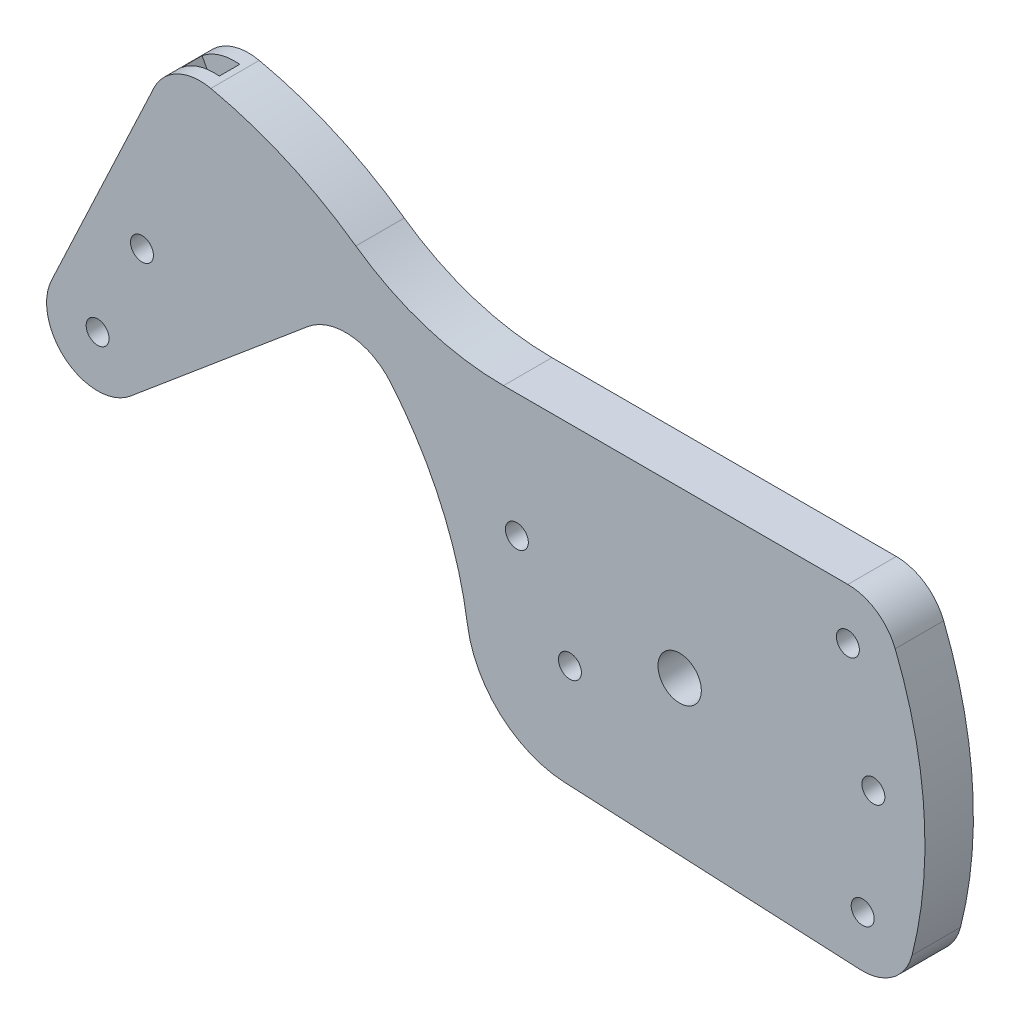
ISO-10303-21;
HEADER;
FILE_DESCRIPTION(('STEP AP214'),'2;1');
FILE_NAME('part.step','',(''),(''),'','','');
FILE_SCHEMA(('AUTOMOTIVE_DESIGN { 1 0 10303 214 1 1 1 1 }'));
ENDSEC;
DATA;
#1=APPLICATION_CONTEXT('core data for automotive mechanical design processes');
#2=APPLICATION_PROTOCOL_DEFINITION('international standard','automotive_design',2000,#1);
#3=PRODUCT_CONTEXT('',#1,'mechanical');
#4=PRODUCT('Part','Part','',(#3));
#5=PRODUCT_RELATED_PRODUCT_CATEGORY('part','',(#4));
#6=PRODUCT_DEFINITION_FORMATION('','',#4);
#7=PRODUCT_DEFINITION_CONTEXT('part definition',#1,'design');
#8=PRODUCT_DEFINITION('design','',#6,#7);
#9=PRODUCT_DEFINITION_SHAPE('','',#8);
#10=(LENGTH_UNIT() NAMED_UNIT(*) SI_UNIT(.MILLI.,.METRE.));
#11=(NAMED_UNIT(*) PLANE_ANGLE_UNIT() SI_UNIT($,.RADIAN.));
#12=(NAMED_UNIT(*) SI_UNIT($,.STERADIAN.) SOLID_ANGLE_UNIT());
#13=UNCERTAINTY_MEASURE_WITH_UNIT(LENGTH_MEASURE(1.E-05),#10,'distance_accuracy_value','');
#14=(GEOMETRIC_REPRESENTATION_CONTEXT(3) GLOBAL_UNCERTAINTY_ASSIGNED_CONTEXT((#13)) GLOBAL_UNIT_ASSIGNED_CONTEXT((#10,
#11,#12)) REPRESENTATION_CONTEXT('',''));
#15=CARTESIAN_POINT('',(0.,0.,0.));
#16=DIRECTION('',(0.,0.,1.));
#17=DIRECTION('',(1.,0.,0.));
#18=AXIS2_PLACEMENT_3D('',#15,#16,#17);
#19=CARTESIAN_POINT('',(-94.0366346201967,44.4012909844925,4.75));
#20=DIRECTION('',(0.,0.,-1.));
#21=DIRECTION('',(-1.,0.,0.));
#22=AXIS2_PLACEMENT_3D('',#19,#20,#21);
#23=CYLINDRICAL_SURFACE('',#22,9.99999999999999);
#24=CARTESIAN_POINT('',(-94.0366346201967,44.4012909844925,-4.75));
#25=DIRECTION('',(0.,0.,1.));
#26=DIRECTION('',(1.,0.,0.));
#27=AXIS2_PLACEMENT_3D('',#24,#25,#26);
#28=CIRCLE('',#27,9.99999999999999);
#29=CARTESIAN_POINT('',(-91.9187421242096,54.174444588905,-4.75));
#30=VERTEX_POINT('',#29);
#31=CARTESIAN_POINT('',(-103.085929893281,48.6569055183213,-4.75));
#32=VERTEX_POINT('',#31);
#33=EDGE_CURVE('E339',#30,#32,#28,.T.);
#34=ORIENTED_EDGE('',*,*,#33,.T.);
#35=DIRECTION('',(0.,0.,-1.));
#36=VECTOR('',#35,1.);
#37=CARTESIAN_POINT('',(-103.085929893281,48.6569055183213,4.75));
#38=LINE('',#37,#36);
#39=CARTESIAN_POINT('',(-103.085929893281,48.6569055183213,4.75));
#40=VERTEX_POINT('',#39);
#41=EDGE_CURVE('E450',#40,#32,#38,.T.);
#42=ORIENTED_EDGE('',*,*,#41,.F.);
#43=CARTESIAN_POINT('',(-94.0366346201967,44.4012909844925,4.75));
#44=DIRECTION('',(0.,0.,1.));
#45=DIRECTION('',(1.,0.,0.));
#46=AXIS2_PLACEMENT_3D('',#43,#44,#45);
#47=CIRCLE('',#46,9.99999999999999);
#48=CARTESIAN_POINT('',(-91.9187421242096,54.174444588905,4.75));
#49=VERTEX_POINT('',#48);
#50=EDGE_CURVE('E259',#49,#40,#47,.T.);
#51=ORIENTED_EDGE('',*,*,#50,.F.);
#52=DIRECTION('',(0.,0.,-1.));
#53=VECTOR('',#52,1.);
#54=CARTESIAN_POINT('',(-91.9187421242096,54.174444588905,4.75));
#55=LINE('',#54,#53);
#56=EDGE_CURVE('E50',#49,#30,#55,.T.);
#57=ORIENTED_EDGE('',*,*,#56,.T.);
#58=EDGE_LOOP('',(#34,#42,#51,#57));
#59=FACE_BOUND('',#58,.T.);
#60=CARTESIAN_POINT('',(-94.0366346201967,44.4012909844925,-2.));
#61=DIRECTION('',(0.,0.,1.));
#62=DIRECTION('',(1.,0.,0.));
#63=AXIS2_PLACEMENT_3D('',#60,#61,#62);
#64=CIRCLE('',#63,9.99999999999998);
#65=CARTESIAN_POINT('',(-93.0022176769861,54.3476461755964,-2.));
#66=VERTEX_POINT('',#65);
#67=CARTESIAN_POINT('',(-100.382341665289,52.1299391261703,-2.));
#68=VERTEX_POINT('',#67);
#69=EDGE_CURVE('E197',#66,#68,#64,.T.);
#70=ORIENTED_EDGE('',*,*,#69,.F.);
#71=DIRECTION('',(0.,0.,1.));
#72=VECTOR('',#71,1.);
#73=CARTESIAN_POINT('',(-93.0022176769861,54.3476461755964,-2.));
#74=LINE('',#73,#72);
#75=CARTESIAN_POINT('',(-93.0022176769861,54.3476461755964,2.));
#76=VERTEX_POINT('',#75);
#77=EDGE_CURVE('E179',#66,#76,#74,.T.);
#78=ORIENTED_EDGE('',*,*,#77,.T.);
#79=CARTESIAN_POINT('',(-94.0366346201967,44.4012909844925,2.));
#80=DIRECTION('',(0.,0.,1.));
#81=DIRECTION('',(1.,0.,0.));
#82=AXIS2_PLACEMENT_3D('',#79,#80,#81);
#83=CIRCLE('',#82,9.99999999999998);
#84=CARTESIAN_POINT('',(-100.382341665289,52.1299391261703,2.));
#85=VERTEX_POINT('',#84);
#86=EDGE_CURVE('E220',#76,#85,#83,.T.);
#87=ORIENTED_EDGE('',*,*,#86,.T.);
#88=DIRECTION('',(0.,0.,1.));
#89=VECTOR('',#88,1.);
#90=CARTESIAN_POINT('',(-100.382341665289,52.1299391261703,-2.));
#91=LINE('',#90,#89);
#92=EDGE_CURVE('E190',#68,#85,#91,.T.);
#93=ORIENTED_EDGE('',*,*,#92,.F.);
#94=EDGE_LOOP('',(#70,#78,#87,#93));
#95=FACE_BOUND('',#94,.T.);
#96=ADVANCED_FACE('F41',(#59,#95),#23,.T.);
#97=CARTESIAN_POINT('',(-41.5599291638824,49.5291948890183,4.75));
#98=DIRECTION('',(-0.642787609686535,0.766044443118982,0.));
#99=DIRECTION('',(-0.766044443118982,-0.642787609686535,0.));
#100=AXIS2_PLACEMENT_3D('',#97,#98,#99);
#101=PLANE('',#100);
#102=DIRECTION('',(0.766044443118982,0.642787609686535,0.));
#103=VECTOR('',#102,1.);
#104=CARTESIAN_POINT('',(-41.5599291638824,49.5291948890183,-4.75));
#105=LINE('',#104,#103);
#106=CARTESIAN_POINT('',(-107.689906175498,-5.96044443118984,-4.75));
#107=VERTEX_POINT('',#106);
#108=CARTESIAN_POINT('',(-72.8648183450266,23.2612739230748,-4.75));
#109=VERTEX_POINT('',#108);
#110=EDGE_CURVE('E350',#107,#109,#105,.T.);
#111=ORIENTED_EDGE('',*,*,#110,.T.);
#112=DIRECTION('',(0.,0.,-1.));
#113=VECTOR('',#112,1.);
#114=CARTESIAN_POINT('',(-72.8648183450266,23.2612739230748,4.75));
#115=LINE('',#114,#113);
#116=CARTESIAN_POINT('',(-72.8648183450266,23.2612739230748,4.75));
#117=VERTEX_POINT('',#116);
#118=EDGE_CURVE('E440',#117,#109,#115,.T.);
#119=ORIENTED_EDGE('',*,*,#118,.F.);
#120=DIRECTION('',(0.766044443118982,0.642787609686535,0.));
#121=VECTOR('',#120,1.);
#122=CARTESIAN_POINT('',(-41.5599291638824,49.5291948890183,4.75));
#123=LINE('',#122,#121);
#124=CARTESIAN_POINT('',(-107.689906175498,-5.96044443118984,4.75));
#125=VERTEX_POINT('',#124);
#126=EDGE_CURVE('E269',#125,#117,#123,.T.);
#127=ORIENTED_EDGE('',*,*,#126,.F.);
#128=DIRECTION('',(0.,0.,-1.));
#129=VECTOR('',#128,1.);
#130=CARTESIAN_POINT('',(-107.689906175498,-5.96044443118984,4.75));
#131=LINE('',#130,#129);
#132=EDGE_CURVE('E443',#125,#107,#131,.T.);
#133=ORIENTED_EDGE('',*,*,#132,.T.);
#134=EDGE_LOOP('',(#111,#119,#127,#133));
#135=FACE_BOUND('',#134,.T.);
#136=DIRECTION('',(0.766044443118982,0.642787609686534,0.));
#137=VECTOR('',#136,1.);
#138=CARTESIAN_POINT('',(-41.5599291638823,49.5291948890183,-2.));
#139=LINE('',#138,#137);
#140=CARTESIAN_POINT('',(-92.3690173131185,6.89530776254084,-2.));
#141=VERTEX_POINT('',#140);
#142=CARTESIAN_POINT('',(-78.2271294468595,18.7617606552691,-2.));
#143=VERTEX_POINT('',#142);
#144=EDGE_CURVE('E213',#141,#143,#139,.T.);
#145=ORIENTED_EDGE('',*,*,#144,.F.);
#146=DIRECTION('',(0.,0.,1.));
#147=VECTOR('',#146,1.);
#148=CARTESIAN_POINT('',(-92.3690173131185,6.89530776254084,-2.));
#149=LINE('',#148,#147);
#150=CARTESIAN_POINT('',(-92.3690173131185,6.89530776254084,2.));
#151=VERTEX_POINT('',#150);
#152=EDGE_CURVE('E242',#141,#151,#149,.T.);
#153=ORIENTED_EDGE('',*,*,#152,.T.);
#154=DIRECTION('',(0.766044443118982,0.642787609686534,0.));
#155=VECTOR('',#154,1.);
#156=CARTESIAN_POINT('',(-41.5599291638823,49.5291948890183,2.));
#157=LINE('',#156,#155);
#158=CARTESIAN_POINT('',(-78.2271294468595,18.7617606552691,2.));
#159=VERTEX_POINT('',#158);
#160=EDGE_CURVE('E229',#151,#159,#157,.T.);
#161=ORIENTED_EDGE('',*,*,#160,.T.);
#162=DIRECTION('',(0.,0.,1.));
#163=VECTOR('',#162,1.);
#164=CARTESIAN_POINT('',(-78.2271294468595,18.7617606552691,-2.));
#165=LINE('',#164,#163);
#166=EDGE_CURVE('E239',#143,#159,#165,.T.);
#167=ORIENTED_EDGE('',*,*,#166,.F.);
#168=EDGE_LOOP('',(#145,#153,#161,#167));
#169=FACE_BOUND('',#168,.T.);
#170=ADVANCED_FACE('F518',(#135,#169),#101,.F.);
#171=CARTESIAN_POINT('',(-34.5381520802066,82.4,4.75));
#172=DIRECTION('',(0.,0.,-1.));
#173=DIRECTION('',(-1.,0.,0.));
#174=AXIS2_PLACEMENT_3D('',#171,#172,#173);
#175=CYLINDRICAL_SURFACE('',#174,50.);
#176=CARTESIAN_POINT('',(-34.5381520802066,82.4,-4.75));
#177=DIRECTION('',(0.,0.,1.));
#178=DIRECTION('',(1.,0.,0.));
#179=AXIS2_PLACEMENT_3D('',#176,#177,#178);
#180=CIRCLE('',#179,50.);
#181=CARTESIAN_POINT('',(-63.4870210289497,41.6328197370912,-4.75));
#182=VERTEX_POINT('',#181);
#183=CARTESIAN_POINT('',(-34.5381520802066,32.4,-4.75));
#184=VERTEX_POINT('',#183);
#185=EDGE_CURVE('E238',#182,#184,#180,.T.);
#186=ORIENTED_EDGE('',*,*,#185,.F.);
#187=DIRECTION('',(0.,0.,-1.));
#188=VECTOR('',#187,1.);
#189=CARTESIAN_POINT('',(-63.4870210289497,41.6328197370912,4.75));
#190=LINE('',#189,#188);
#191=CARTESIAN_POINT('',(-63.4870210289497,41.6328197370912,4.75));
#192=VERTEX_POINT('',#191);
#193=EDGE_CURVE('E11',#192,#182,#190,.T.);
#194=ORIENTED_EDGE('',*,*,#193,.F.);
#195=CARTESIAN_POINT('',(-34.5381520802066,82.4,4.75));
#196=DIRECTION('',(0.,0.,1.));
#197=DIRECTION('',(1.,0.,0.));
#198=AXIS2_PLACEMENT_3D('',#195,#196,#197);
#199=CIRCLE('',#198,50.);
#200=CARTESIAN_POINT('',(-34.5381520802066,32.4,4.75));
#201=VERTEX_POINT('',#200);
#202=EDGE_CURVE('E251',#192,#201,#199,.T.);
#203=ORIENTED_EDGE('',*,*,#202,.T.);
#204=DIRECTION('',(0.,0.,-1.));
#205=VECTOR('',#204,1.);
#206=CARTESIAN_POINT('',(-34.5381520802066,32.4,4.75));
#207=LINE('',#206,#205);
#208=EDGE_CURVE('E332',#201,#184,#207,.T.);
#209=ORIENTED_EDGE('',*,*,#208,.T.);
#210=EDGE_LOOP('',(#186,#194,#203,#209));
#211=FACE_BOUND('',#210,.T.);
#212=ADVANCED_FACE('F43',(#211),#175,.F.);
#213=CARTESIAN_POINT('',(-108.317782272363,-21.5,4.75));
#214=DIRECTION('',(0.,0.,-1.));
#215=DIRECTION('',(-1.,0.,0.));
#216=AXIS2_PLACEMENT_3D('',#213,#214,#215);
#217=CYLINDRICAL_SURFACE('',#216,77.4309374967139);
#218=CARTESIAN_POINT('',(-108.317782272363,-21.5,-4.75));
#219=DIRECTION('',(0.,0.,1.));
#220=DIRECTION('',(1.,0.,0.));
#221=AXIS2_PLACEMENT_3D('',#218,#219,#220);
#222=CIRCLE('',#221,77.4309374967139);
#223=EDGE_CURVE('E336',#182,#30,#222,.T.);
#224=ORIENTED_EDGE('',*,*,#223,.T.);
#225=ORIENTED_EDGE('',*,*,#56,.F.);
#226=CARTESIAN_POINT('',(-108.317782272363,-21.5,4.75));
#227=DIRECTION('',(0.,0.,1.));
#228=DIRECTION('',(1.,0.,0.));
#229=AXIS2_PLACEMENT_3D('',#226,#227,#228);
#230=CIRCLE('',#229,77.4309374967139);
#231=EDGE_CURVE('E255',#192,#49,#230,.T.);
#232=ORIENTED_EDGE('',*,*,#231,.F.);
#233=ORIENTED_EDGE('',*,*,#193,.T.);
#234=EDGE_LOOP('',(#224,#225,#232,#233));
#235=FACE_BOUND('',#234,.T.);
#236=ADVANCED_FACE('F480',(#235),#217,.T.);
#237=CARTESIAN_POINT('',(-103.154731418742,48.5106034239492,4.75));
#238=DIRECTION('',(-0.904929527308425,0.425561453382882,0.));
#239=DIRECTION('',(-0.425561453382882,-0.904929527308425,0.));
#240=AXIS2_PLACEMENT_3D('',#237,#238,#239);
#241=PLANE('',#240);
#242=DIRECTION('',(0.425561453382882,0.904929527308425,0.));
#243=VECTOR('',#242,1.);
#244=CARTESIAN_POINT('',(-103.154731418742,48.5106034239492,-4.75));
#245=LINE('',#244,#243);
#246=CARTESIAN_POINT('',(-123.167077545448,5.9556145338288,-4.75));
#247=VERTEX_POINT('',#246);
#248=EDGE_CURVE('E343',#247,#32,#245,.T.);
#249=ORIENTED_EDGE('',*,*,#248,.F.);
#250=DIRECTION('',(0.,0.,-1.));
#251=VECTOR('',#250,1.);
#252=CARTESIAN_POINT('',(-123.167077545448,5.9556145338288,4.75));
#253=LINE('',#252,#251);
#254=CARTESIAN_POINT('',(-123.167077545448,5.9556145338288,4.75));
#255=VERTEX_POINT('',#254);
#256=EDGE_CURVE('E447',#255,#247,#253,.T.);
#257=ORIENTED_EDGE('',*,*,#256,.F.);
#258=DIRECTION('',(0.425561453382882,0.904929527308425,0.));
#259=VECTOR('',#258,1.);
#260=CARTESIAN_POINT('',(-103.154731418742,48.5106034239492,4.75));
#261=LINE('',#260,#259);
#262=EDGE_CURVE('E262',#255,#40,#261,.T.);
#263=ORIENTED_EDGE('',*,*,#262,.T.);
#264=ORIENTED_EDGE('',*,*,#41,.T.);
#265=EDGE_LOOP('',(#249,#257,#263,#264));
#266=FACE_BOUND('',#265,.T.);
#267=ADVANCED_FACE('F471',(#266),#241,.T.);
#268=CARTESIAN_POINT('',(-114.117782272363,1.69999999999999,4.75));
#269=DIRECTION('',(0.,0.,-1.));
#270=DIRECTION('',(-1.,0.,0.));
#271=AXIS2_PLACEMENT_3D('',#268,#269,#270);
#272=CYLINDRICAL_SURFACE('',#271,9.99999999999999);
#273=CARTESIAN_POINT('',(-114.117782272363,1.69999999999999,-4.75));
#274=DIRECTION('',(0.,0.,1.));
#275=DIRECTION('',(1.,0.,0.));
#276=AXIS2_PLACEMENT_3D('',#273,#274,#275);
#277=CIRCLE('',#276,9.99999999999999);
#278=EDGE_CURVE('E347',#247,#107,#277,.T.);
#279=ORIENTED_EDGE('',*,*,#278,.T.);
#280=ORIENTED_EDGE('',*,*,#132,.F.);
#281=CARTESIAN_POINT('',(-114.117782272363,1.69999999999999,4.75));
#282=DIRECTION('',(0.,0.,1.));
#283=DIRECTION('',(1.,0.,0.));
#284=AXIS2_PLACEMENT_3D('',#281,#282,#283);
#285=CIRCLE('',#284,9.99999999999999);
#286=EDGE_CURVE('E266',#255,#125,#285,.T.);
#287=ORIENTED_EDGE('',*,*,#286,.F.);
#288=ORIENTED_EDGE('',*,*,#256,.T.);
#289=EDGE_LOOP('',(#279,#280,#287,#288));
#290=FACE_BOUND('',#289,.T.);
#291=ADVANCED_FACE('F522',(#290),#272,.T.);
#292=CARTESIAN_POINT('',(-65.4725042221845,14.4514570095927,4.75));
#293=DIRECTION('',(0.,0.,-1.));
#294=DIRECTION('',(-1.,0.,0.));
#295=AXIS2_PLACEMENT_3D('',#292,#293,#294);
#296=CYLINDRICAL_SURFACE('',#295,11.5003992165423);
#297=CARTESIAN_POINT('',(-65.4725042221845,14.4514570095927,-4.75));
#298=DIRECTION('',(0.,0.,1.));
#299=DIRECTION('',(1.,0.,0.));
#300=AXIS2_PLACEMENT_3D('',#297,#298,#299);
#301=CIRCLE('',#300,11.5003992165423);
#302=CARTESIAN_POINT('',(-56.6626873087024,21.8437711324349,-4.75));
#303=VERTEX_POINT('',#302);
#304=EDGE_CURVE('E354',#303,#109,#301,.T.);
#305=ORIENTED_EDGE('',*,*,#304,.F.);
#306=DIRECTION('',(0.,0.,-1.));
#307=VECTOR('',#306,1.);
#308=CARTESIAN_POINT('',(-56.6626873087024,21.8437711324349,4.75));
#309=LINE('',#308,#307);
#310=CARTESIAN_POINT('',(-56.6626873087024,21.8437711324349,4.75));
#311=VERTEX_POINT('',#310);
#312=EDGE_CURVE('E437',#311,#303,#309,.T.);
#313=ORIENTED_EDGE('',*,*,#312,.F.);
#314=CARTESIAN_POINT('',(-65.4725042221845,14.4514570095927,4.75));
#315=DIRECTION('',(0.,0.,1.));
#316=DIRECTION('',(1.,0.,0.));
#317=AXIS2_PLACEMENT_3D('',#314,#315,#316);
#318=CIRCLE('',#317,11.5003992165423);
#319=EDGE_CURVE('E272',#311,#117,#318,.T.);
#320=ORIENTED_EDGE('',*,*,#319,.T.);
#321=ORIENTED_EDGE('',*,*,#118,.T.);
#322=EDGE_LOOP('',(#305,#313,#320,#321));
#323=FACE_BOUND('',#322,.T.);
#324=ADVANCED_FACE('F515',(#323),#296,.F.);
#325=CARTESIAN_POINT('',(-108.317782272363,-21.5,4.75));
#326=DIRECTION('',(0.,0.,-1.));
#327=DIRECTION('',(-1.,0.,0.));
#328=AXIS2_PLACEMENT_3D('',#325,#326,#327);
#329=CYLINDRICAL_SURFACE('',#328,67.4309374967139);
#330=CARTESIAN_POINT('',(-108.317782272363,-21.5,-4.75));
#331=DIRECTION('',(0.,0.,1.));
#332=DIRECTION('',(1.,0.,0.));
#333=AXIS2_PLACEMENT_3D('',#330,#331,#332);
#334=CIRCLE('',#333,67.4309374967139);
#335=CARTESIAN_POINT('',(-41.6082780723541,-11.662653758524,-4.75));
#336=VERTEX_POINT('',#335);
#337=EDGE_CURVE('E358',#336,#303,#334,.T.);
#338=ORIENTED_EDGE('',*,*,#337,.F.);
#339=DIRECTION('',(0.,0.,-1.));
#340=VECTOR('',#339,1.);
#341=CARTESIAN_POINT('',(-41.6082780723541,-11.662653758524,4.75));
#342=LINE('',#341,#340);
#343=CARTESIAN_POINT('',(-41.6082780723541,-11.662653758524,4.75));
#344=VERTEX_POINT('',#343);
#345=EDGE_CURVE('E434',#344,#336,#342,.T.);
#346=ORIENTED_EDGE('',*,*,#345,.F.);
#347=CARTESIAN_POINT('',(-108.317782272363,-21.5,4.75));
#348=DIRECTION('',(0.,0.,1.));
#349=DIRECTION('',(1.,0.,0.));
#350=AXIS2_PLACEMENT_3D('',#347,#348,#349);
#351=CIRCLE('',#350,67.4309374967139);
#352=EDGE_CURVE('E276',#344,#311,#351,.T.);
#353=ORIENTED_EDGE('',*,*,#352,.T.);
#354=ORIENTED_EDGE('',*,*,#312,.T.);
#355=EDGE_LOOP('',(#338,#346,#353,#354));
#356=FACE_BOUND('',#355,.T.);
#357=ADVANCED_FACE('F509',(#356),#329,.F.);
#358=CARTESIAN_POINT('',(-21.5177822723635,-8.70000000000001,4.75));
#359=DIRECTION('',(0.,0.,-1.));
#360=DIRECTION('',(-1.,0.,0.));
#361=AXIS2_PLACEMENT_3D('',#358,#359,#360);
#362=CYLINDRICAL_SURFACE('',#361,20.3077654797946);
#363=CARTESIAN_POINT('',(-21.5177822723635,-8.70000000000001,-4.75));
#364=DIRECTION('',(0.,0.,1.));
#365=DIRECTION('',(1.,0.,0.));
#366=AXIS2_PLACEMENT_3D('',#363,#364,#365);
#367=CIRCLE('',#366,20.3077654797946);
#368=CARTESIAN_POINT('',(-22.5002308320871,-28.9839871230938,-4.75));
#369=VERTEX_POINT('',#368);
#370=EDGE_CURVE('E362',#336,#369,#367,.T.);
#371=ORIENTED_EDGE('',*,*,#370,.T.);
#372=DIRECTION('',(0.,0.,-1.));
#373=VECTOR('',#372,1.);
#374=CARTESIAN_POINT('',(-22.5002308320871,-28.9839871230938,4.75));
#375=LINE('',#374,#373);
#376=CARTESIAN_POINT('',(-22.5002308320871,-28.9839871230938,4.75));
#377=VERTEX_POINT('',#376);
#378=EDGE_CURVE('E431',#377,#369,#375,.T.);
#379=ORIENTED_EDGE('',*,*,#378,.F.);
#380=CARTESIAN_POINT('',(-21.5177822723635,-8.70000000000001,4.75));
#381=DIRECTION('',(0.,0.,1.));
#382=DIRECTION('',(1.,0.,0.));
#383=AXIS2_PLACEMENT_3D('',#380,#381,#382);
#384=CIRCLE('',#383,20.3077654797946);
#385=EDGE_CURVE('E280',#344,#377,#384,.T.);
#386=ORIENTED_EDGE('',*,*,#385,.F.);
#387=ORIENTED_EDGE('',*,*,#345,.T.);
#388=EDGE_LOOP('',(#371,#379,#386,#387));
#389=FACE_BOUND('',#388,.T.);
#390=ADVANCED_FACE('F712',(#389),#362,.T.);
#391=CARTESIAN_POINT('',(-1.45320494845944,-30.0033932260633,4.75));
#392=DIRECTION('',(-0.0483779744601208,-0.998829100290503,0.));
#393=DIRECTION('',(0.998829100290503,-0.0483779744601208,0.));
#394=AXIS2_PLACEMENT_3D('',#391,#392,#393);
#395=PLANE('',#394);
#396=DIRECTION('',(-0.998829100290503,0.0483779744601208,0.));
#397=VECTOR('',#396,1.);
#398=CARTESIAN_POINT('',(-1.45320494845944,-30.0033932260633,-4.75));
#399=LINE('',#398,#397);
#400=CARTESIAN_POINT('',(35.3984379830354,-31.788291002905,-4.75));
#401=VERTEX_POINT('',#400);
#402=EDGE_CURVE('E366',#401,#369,#399,.T.);
#403=ORIENTED_EDGE('',*,*,#402,.F.);
#404=DIRECTION('',(0.,0.,-1.));
#405=VECTOR('',#404,1.);
#406=CARTESIAN_POINT('',(35.3984379830354,-31.788291002905,4.75));
#407=LINE('',#406,#405);
#408=CARTESIAN_POINT('',(35.3984379830354,-31.788291002905,4.75));
#409=VERTEX_POINT('',#408);
#410=EDGE_CURVE('E428',#409,#401,#407,.T.);
#411=ORIENTED_EDGE('',*,*,#410,.F.);
#412=DIRECTION('',(-0.998829100290503,0.0483779744601208,0.));
#413=VECTOR('',#412,1.);
#414=CARTESIAN_POINT('',(-1.45320494845944,-30.0033932260633,4.75));
#415=LINE('',#414,#413);
#416=EDGE_CURVE('E283',#409,#377,#415,.T.);
#417=ORIENTED_EDGE('',*,*,#416,.T.);
#418=ORIENTED_EDGE('',*,*,#378,.T.);
#419=EDGE_LOOP('',(#403,#411,#417,#418));
#420=FACE_BOUND('',#419,.T.);
#421=ADVANCED_FACE('F503',(#420),#395,.T.);
#422=CARTESIAN_POINT('',(35.8822177276366,-21.8,4.75));
#423=DIRECTION('',(0.,0.,-1.));
#424=DIRECTION('',(-1.,0.,0.));
#425=AXIS2_PLACEMENT_3D('',#422,#423,#424);
#426=CYLINDRICAL_SURFACE('',#425,9.99999999999999);
#427=CARTESIAN_POINT('',(35.8822177276366,-21.8,-4.75));
#428=DIRECTION('',(0.,0.,1.));
#429=DIRECTION('',(1.,0.,0.));
#430=AXIS2_PLACEMENT_3D('',#427,#428,#429);
#431=CIRCLE('',#430,9.99999999999999);
#432=CARTESIAN_POINT('',(45.5722671365024,-24.2704134175759,-4.75));
#433=VERTEX_POINT('',#432);
#434=EDGE_CURVE('E370',#401,#433,#431,.T.);
#435=ORIENTED_EDGE('',*,*,#434,.T.);
#436=DIRECTION('',(0.,0.,-1.));
#437=VECTOR('',#436,1.);
#438=CARTESIAN_POINT('',(45.5722671365024,-24.2704134175759,4.75));
#439=LINE('',#438,#437);
#440=CARTESIAN_POINT('',(45.5722671365024,-24.2704134175759,4.75));
#441=VERTEX_POINT('',#440);
#442=EDGE_CURVE('E424',#441,#433,#439,.T.);
#443=ORIENTED_EDGE('',*,*,#442,.F.);
#444=CARTESIAN_POINT('',(35.8822177276366,-21.8,4.75));
#445=DIRECTION('',(0.,0.,1.));
#446=DIRECTION('',(1.,0.,0.));
#447=AXIS2_PLACEMENT_3D('',#444,#445,#446);
#448=CIRCLE('',#447,9.99999999999999);
#449=EDGE_CURVE('E287',#409,#441,#448,.T.);
#450=ORIENTED_EDGE('',*,*,#449,.F.);
#451=ORIENTED_EDGE('',*,*,#410,.T.);
#452=EDGE_LOOP('',(#435,#443,#450,#451));
#453=FACE_BOUND('',#452,.T.);
#454=ADVANCED_FACE('F500',(#453),#426,.T.);
#455=CARTESIAN_POINT('',(-33.3576699128129,-4.14775280898879,4.75));
#456=DIRECTION('',(0.,0.,-1.));
#457=DIRECTION('',(-1.,0.,0.));
#458=AXIS2_PLACEMENT_3D('',#455,#456,#457);
#459=CYLINDRICAL_SURFACE('',#458,81.4546280611314);
#460=CARTESIAN_POINT('',(-33.3576699128129,-4.14775280898879,-4.75));
#461=DIRECTION('',(0.,0.,1.));
#462=DIRECTION('',(1.,0.,0.));
#463=AXIS2_PLACEMENT_3D('',#460,#461,#462);
#464=CIRCLE('',#463,81.4546280611314);
#465=CARTESIAN_POINT('',(42.2664151883936,26.1153300673927,-4.75));
#466=VERTEX_POINT('',#465);
#467=EDGE_CURVE('E373',#433,#466,#464,.T.);
#468=ORIENTED_EDGE('',*,*,#467,.T.);
#469=DIRECTION('',(0.,0.,-1.));
#470=VECTOR('',#469,1.);
#471=CARTESIAN_POINT('',(42.2664151883936,26.1153300673927,4.75));
#472=LINE('',#471,#470);
#473=CARTESIAN_POINT('',(42.2664151883936,26.1153300673927,4.75));
#474=VERTEX_POINT('',#473);
#475=EDGE_CURVE('E420',#474,#466,#472,.T.);
#476=ORIENTED_EDGE('',*,*,#475,.F.);
#477=CARTESIAN_POINT('',(-33.3576699128129,-4.14775280898879,4.75));
#478=DIRECTION('',(0.,0.,1.));
#479=DIRECTION('',(1.,0.,0.));
#480=AXIS2_PLACEMENT_3D('',#477,#478,#479);
#481=CIRCLE('',#480,81.4546280611314);
#482=EDGE_CURVE('E290',#441,#474,#481,.T.);
#483=ORIENTED_EDGE('',*,*,#482,.F.);
#484=ORIENTED_EDGE('',*,*,#442,.T.);
#485=EDGE_LOOP('',(#468,#476,#483,#484));
#486=FACE_BOUND('',#485,.T.);
#487=ADVANCED_FACE('F495',(#486),#459,.T.);
#488=CARTESIAN_POINT('',(32.9822177276365,22.4,4.75));
#489=DIRECTION('',(0.,0.,-1.));
#490=DIRECTION('',(-1.,0.,0.));
#491=AXIS2_PLACEMENT_3D('',#488,#489,#490);
#492=CYLINDRICAL_SURFACE('',#491,9.99999999999999);
#493=CARTESIAN_POINT('',(32.9822177276365,22.4,-4.75));
#494=DIRECTION('',(0.,0.,1.));
#495=DIRECTION('',(1.,0.,0.));
#496=AXIS2_PLACEMENT_3D('',#493,#494,#495);
#497=CIRCLE('',#496,9.99999999999999);
#498=CARTESIAN_POINT('',(32.9822177276365,32.4,-4.75));
#499=VERTEX_POINT('',#498);
#500=EDGE_CURVE('E376',#466,#499,#497,.T.);
#501=ORIENTED_EDGE('',*,*,#500,.T.);
#502=DIRECTION('',(0.,0.,-1.));
#503=VECTOR('',#502,1.);
#504=CARTESIAN_POINT('',(32.9822177276365,32.4,4.75));
#505=LINE('',#504,#503);
#506=CARTESIAN_POINT('',(32.9822177276365,32.4,4.75));
#507=VERTEX_POINT('',#506);
#508=EDGE_CURVE('E417',#507,#499,#505,.T.);
#509=ORIENTED_EDGE('',*,*,#508,.F.);
#510=CARTESIAN_POINT('',(32.9822177276365,22.4,4.75));
#511=DIRECTION('',(0.,0.,1.));
#512=DIRECTION('',(1.,0.,0.));
#513=AXIS2_PLACEMENT_3D('',#510,#511,#512);
#514=CIRCLE('',#513,9.99999999999999);
#515=EDGE_CURVE('E293',#474,#507,#514,.T.);
#516=ORIENTED_EDGE('',*,*,#515,.F.);
#517=ORIENTED_EDGE('',*,*,#475,.T.);
#518=EDGE_LOOP('',(#501,#509,#516,#517));
#519=FACE_BOUND('',#518,.T.);
#520=ADVANCED_FACE('F489',(#519),#492,.T.);
#521=CARTESIAN_POINT('',(-105.417782272363,20.2,4.75));
#522=DIRECTION('',(0.,0.,-1.));
#523=DIRECTION('',(-1.,0.,0.));
#524=AXIS2_PLACEMENT_3D('',#521,#522,#523);
#525=CYLINDRICAL_SURFACE('',#524,2.25);
#526=CARTESIAN_POINT('',(-105.417782272363,20.2,4.75));
#527=DIRECTION('',(0.,0.,1.));
#528=DIRECTION('',(1.,0.,0.));
#529=AXIS2_PLACEMENT_3D('',#526,#527,#528);
#530=CIRCLE('',#529,2.25);
#531=CARTESIAN_POINT('',(-103.167782272363,20.2,4.75));
#532=VERTEX_POINT('',#531);
#533=EDGE_CURVE('E324',#532,#532,#530,.T.);
#534=ORIENTED_EDGE('',*,*,#533,.T.);
#535=EDGE_LOOP('',(#534));
#536=FACE_BOUND('',#535,.T.);
#537=CARTESIAN_POINT('',(-105.417782272363,20.2,-4.75));
#538=DIRECTION('',(0.,0.,1.));
#539=DIRECTION('',(1.,0.,0.));
#540=AXIS2_PLACEMENT_3D('',#537,#538,#539);
#541=CIRCLE('',#540,2.25);
#542=CARTESIAN_POINT('',(-103.167782272363,20.2,-4.75));
#543=VERTEX_POINT('',#542);
#544=EDGE_CURVE('E408',#543,#543,#541,.T.);
#545=ORIENTED_EDGE('',*,*,#544,.F.);
#546=EDGE_LOOP('',(#545));
#547=FACE_BOUND('',#546,.T.);
#548=ADVANCED_FACE('F664',(#536,#547),#525,.F.);
#549=CARTESIAN_POINT('',(0.,0.,4.75));
#550=DIRECTION('',(0.,0.,-1.));
#551=DIRECTION('',(-1.,0.,0.));
#552=AXIS2_PLACEMENT_3D('',#549,#550,#551);
#553=CYLINDRICAL_SURFACE('',#552,4.25);
#554=CARTESIAN_POINT('',(0.,0.,4.75));
#555=DIRECTION('',(0.,0.,1.));
#556=DIRECTION('',(1.,0.,0.));
#557=AXIS2_PLACEMENT_3D('',#554,#555,#556);
#558=CIRCLE('',#557,4.25);
#559=CARTESIAN_POINT('',(4.25,0.,4.75));
#560=VERTEX_POINT('',#559);
#561=EDGE_CURVE('E320',#560,#560,#558,.T.);
#562=ORIENTED_EDGE('',*,*,#561,.T.);
#563=EDGE_LOOP('',(#562));
#564=FACE_BOUND('',#563,.T.);
#565=CARTESIAN_POINT('',(0.,0.,-4.75));
#566=DIRECTION('',(0.,0.,1.));
#567=DIRECTION('',(1.,0.,0.));
#568=AXIS2_PLACEMENT_3D('',#565,#566,#567);
#569=CIRCLE('',#568,4.25);
#570=CARTESIAN_POINT('',(4.25,0.,-4.75));
#571=VERTEX_POINT('',#570);
#572=EDGE_CURVE('E404',#571,#571,#569,.T.);
#573=ORIENTED_EDGE('',*,*,#572,.F.);
#574=EDGE_LOOP('',(#573));
#575=FACE_BOUND('',#574,.T.);
#576=ADVANCED_FACE('F653',(#564,#575),#553,.F.);
#577=CARTESIAN_POINT('',(-31.9177822723635,8.19999999999999,4.75));
#578=DIRECTION('',(0.,0.,-1.));
#579=DIRECTION('',(-1.,0.,0.));
#580=AXIS2_PLACEMENT_3D('',#577,#578,#579);
#581=CYLINDRICAL_SURFACE('',#580,2.25);
#582=CARTESIAN_POINT('',(-31.9177822723635,8.19999999999999,4.75));
#583=DIRECTION('',(0.,0.,1.));
#584=DIRECTION('',(1.,0.,0.));
#585=AXIS2_PLACEMENT_3D('',#582,#583,#584);
#586=CIRCLE('',#585,2.25);
#587=CARTESIAN_POINT('',(-29.6677822723635,8.19999999999999,4.75));
#588=VERTEX_POINT('',#587);
#589=EDGE_CURVE('E316',#588,#588,#586,.T.);
#590=ORIENTED_EDGE('',*,*,#589,.T.);
#591=EDGE_LOOP('',(#590));
#592=FACE_BOUND('',#591,.T.);
#593=CARTESIAN_POINT('',(-31.9177822723635,8.19999999999999,-4.75));
#594=DIRECTION('',(0.,0.,1.));
#595=DIRECTION('',(1.,0.,0.));
#596=AXIS2_PLACEMENT_3D('',#593,#594,#595);
#597=CIRCLE('',#596,2.25);
#598=CARTESIAN_POINT('',(-29.6677822723635,8.19999999999999,-4.75));
#599=VERTEX_POINT('',#598);
#600=EDGE_CURVE('E400',#599,#599,#597,.T.);
#601=ORIENTED_EDGE('',*,*,#600,.F.);
#602=EDGE_LOOP('',(#601));
#603=FACE_BOUND('',#602,.T.);
#604=ADVANCED_FACE('F642',(#592,#603),#581,.F.);
#605=CARTESIAN_POINT('',(-21.5177822723635,-8.70000000000001,4.75));
#606=DIRECTION('',(0.,0.,-1.));
#607=DIRECTION('',(-1.,0.,0.));
#608=AXIS2_PLACEMENT_3D('',#605,#606,#607);
#609=CYLINDRICAL_SURFACE('',#608,2.25);
#610=CARTESIAN_POINT('',(-21.5177822723635,-8.70000000000001,4.75));
#611=DIRECTION('',(0.,0.,1.));
#612=DIRECTION('',(1.,0.,0.));
#613=AXIS2_PLACEMENT_3D('',#610,#611,#612);
#614=CIRCLE('',#613,2.25);
#615=CARTESIAN_POINT('',(-19.2677822723635,-8.70000000000001,4.75));
#616=VERTEX_POINT('',#615);
#617=EDGE_CURVE('E312',#616,#616,#614,.T.);
#618=ORIENTED_EDGE('',*,*,#617,.T.);
#619=EDGE_LOOP('',(#618));
#620=FACE_BOUND('',#619,.T.);
#621=CARTESIAN_POINT('',(-21.5177822723635,-8.70000000000001,-4.75));
#622=DIRECTION('',(0.,0.,1.));
#623=DIRECTION('',(1.,0.,0.));
#624=AXIS2_PLACEMENT_3D('',#621,#622,#623);
#625=CIRCLE('',#624,2.25);
#626=CARTESIAN_POINT('',(-19.2677822723635,-8.70000000000001,-4.75));
#627=VERTEX_POINT('',#626);
#628=EDGE_CURVE('E396',#627,#627,#625,.T.);
#629=ORIENTED_EDGE('',*,*,#628,.F.);
#630=EDGE_LOOP('',(#629));
#631=FACE_BOUND('',#630,.T.);
#632=ADVANCED_FACE('F631',(#620,#631),#609,.F.);
#633=CARTESIAN_POINT('',(32.9822177276365,22.4,4.75));
#634=DIRECTION('',(0.,0.,-1.));
#635=DIRECTION('',(-1.,0.,0.));
#636=AXIS2_PLACEMENT_3D('',#633,#634,#635);
#637=CYLINDRICAL_SURFACE('',#636,2.25);
#638=CARTESIAN_POINT('',(32.9822177276365,22.4,4.75));
#639=DIRECTION('',(0.,0.,1.));
#640=DIRECTION('',(1.,0.,0.));
#641=AXIS2_PLACEMENT_3D('',#638,#639,#640);
#642=CIRCLE('',#641,2.25);
#643=CARTESIAN_POINT('',(35.2322177276365,22.4,4.75));
#644=VERTEX_POINT('',#643);
#645=EDGE_CURVE('E308',#644,#644,#642,.T.);
#646=ORIENTED_EDGE('',*,*,#645,.T.);
#647=EDGE_LOOP('',(#646));
#648=FACE_BOUND('',#647,.T.);
#649=CARTESIAN_POINT('',(32.9822177276365,22.4,-4.75));
#650=DIRECTION('',(0.,0.,1.));
#651=DIRECTION('',(1.,0.,0.));
#652=AXIS2_PLACEMENT_3D('',#649,#650,#651);
#653=CIRCLE('',#652,2.25);
#654=CARTESIAN_POINT('',(35.2322177276365,22.4,-4.75));
#655=VERTEX_POINT('',#654);
#656=EDGE_CURVE('E392',#655,#655,#653,.T.);
#657=ORIENTED_EDGE('',*,*,#656,.F.);
#658=EDGE_LOOP('',(#657));
#659=FACE_BOUND('',#658,.T.);
#660=ADVANCED_FACE('F620',(#648,#659),#637,.F.);
#661=CARTESIAN_POINT('',(37.9822177276365,-0.100000000000011,4.75));
#662=DIRECTION('',(0.,0.,-1.));
#663=DIRECTION('',(-1.,0.,0.));
#664=AXIS2_PLACEMENT_3D('',#661,#662,#663);
#665=CYLINDRICAL_SURFACE('',#664,2.25);
#666=CARTESIAN_POINT('',(37.9822177276365,-0.100000000000011,4.75));
#667=DIRECTION('',(0.,0.,1.));
#668=DIRECTION('',(1.,0.,0.));
#669=AXIS2_PLACEMENT_3D('',#666,#667,#668);
#670=CIRCLE('',#669,2.25);
#671=CARTESIAN_POINT('',(40.2322177276366,-0.100000000000011,4.75));
#672=VERTEX_POINT('',#671);
#673=EDGE_CURVE('E304',#672,#672,#670,.T.);
#674=ORIENTED_EDGE('',*,*,#673,.T.);
#675=EDGE_LOOP('',(#674));
#676=FACE_BOUND('',#675,.T.);
#677=CARTESIAN_POINT('',(37.9822177276365,-0.100000000000011,-4.75));
#678=DIRECTION('',(0.,0.,1.));
#679=DIRECTION('',(1.,0.,0.));
#680=AXIS2_PLACEMENT_3D('',#677,#678,#679);
#681=CIRCLE('',#680,2.25);
#682=CARTESIAN_POINT('',(40.2322177276366,-0.100000000000011,-4.75));
#683=VERTEX_POINT('',#682);
#684=EDGE_CURVE('E388',#683,#683,#681,.T.);
#685=ORIENTED_EDGE('',*,*,#684,.F.);
#686=EDGE_LOOP('',(#685));
#687=FACE_BOUND('',#686,.T.);
#688=ADVANCED_FACE('F609',(#676,#687),#665,.F.);
#689=CARTESIAN_POINT('',(35.8822177276366,-21.8,4.75));
#690=DIRECTION('',(0.,0.,-1.));
#691=DIRECTION('',(-1.,0.,0.));
#692=AXIS2_PLACEMENT_3D('',#689,#690,#691);
#693=CYLINDRICAL_SURFACE('',#692,2.25);
#694=CARTESIAN_POINT('',(35.8822177276366,-21.8,4.75));
#695=DIRECTION('',(0.,0.,1.));
#696=DIRECTION('',(1.,0.,0.));
#697=AXIS2_PLACEMENT_3D('',#694,#695,#696);
#698=CIRCLE('',#697,2.25);
#699=CARTESIAN_POINT('',(38.1322177276366,-21.8,4.75));
#700=VERTEX_POINT('',#699);
#701=EDGE_CURVE('E300',#700,#700,#698,.T.);
#702=ORIENTED_EDGE('',*,*,#701,.T.);
#703=EDGE_LOOP('',(#702));
#704=FACE_BOUND('',#703,.T.);
#705=CARTESIAN_POINT('',(35.8822177276366,-21.8,-4.75));
#706=DIRECTION('',(0.,0.,1.));
#707=DIRECTION('',(1.,0.,0.));
#708=AXIS2_PLACEMENT_3D('',#705,#706,#707);
#709=CIRCLE('',#708,2.25);
#710=CARTESIAN_POINT('',(38.1322177276366,-21.8,-4.75));
#711=VERTEX_POINT('',#710);
#712=EDGE_CURVE('E384',#711,#711,#709,.T.);
#713=ORIENTED_EDGE('',*,*,#712,.F.);
#714=EDGE_LOOP('',(#713));
#715=FACE_BOUND('',#714,.T.);
#716=ADVANCED_FACE('F599',(#704,#715),#693,.F.);
#717=CARTESIAN_POINT('',(0.,32.4,4.75));
#718=DIRECTION('',(0.,1.,0.));
#719=DIRECTION('',(0.,0.,1.));
#720=AXIS2_PLACEMENT_3D('',#717,#718,#719);
#721=PLANE('',#720);
#722=DIRECTION('',(1.,0.,0.));
#723=VECTOR('',#722,1.);
#724=CARTESIAN_POINT('',(0.,32.4,-4.75));
#725=LINE('',#724,#723);
#726=EDGE_CURVE('E380',#184,#499,#725,.T.);
#727=ORIENTED_EDGE('',*,*,#726,.F.);
#728=ORIENTED_EDGE('',*,*,#208,.F.);
#729=DIRECTION('',(1.,0.,0.));
#730=VECTOR('',#729,1.);
#731=CARTESIAN_POINT('',(0.,32.4,4.75));
#732=LINE('',#731,#730);
#733=EDGE_CURVE('E296',#201,#507,#732,.T.);
#734=ORIENTED_EDGE('',*,*,#733,.T.);
#735=ORIENTED_EDGE('',*,*,#508,.T.);
#736=EDGE_LOOP('',(#727,#728,#734,#735));
#737=FACE_BOUND('',#736,.T.);
#738=ADVANCED_FACE('F485',(#737),#721,.T.);
#739=CARTESIAN_POINT('',(-114.117782272363,1.69999999999999,4.75));
#740=DIRECTION('',(0.,0.,-1.));
#741=DIRECTION('',(-1.,0.,0.));
#742=AXIS2_PLACEMENT_3D('',#739,#740,#741);
#743=CYLINDRICAL_SURFACE('',#742,2.25);
#744=CARTESIAN_POINT('',(-114.117782272363,1.69999999999999,4.75));
#745=DIRECTION('',(0.,0.,1.));
#746=DIRECTION('',(1.,0.,0.));
#747=AXIS2_PLACEMENT_3D('',#744,#745,#746);
#748=CIRCLE('',#747,2.25);
#749=CARTESIAN_POINT('',(-111.867782272363,1.69999999999999,4.75));
#750=VERTEX_POINT('',#749);
#751=EDGE_CURVE('E328',#750,#750,#748,.T.);
#752=ORIENTED_EDGE('',*,*,#751,.T.);
#753=EDGE_LOOP('',(#752));
#754=FACE_BOUND('',#753,.T.);
#755=CARTESIAN_POINT('',(-114.117782272363,1.69999999999999,-4.75));
#756=DIRECTION('',(0.,0.,1.));
#757=DIRECTION('',(1.,0.,0.));
#758=AXIS2_PLACEMENT_3D('',#755,#756,#757);
#759=CIRCLE('',#758,2.25);
#760=CARTESIAN_POINT('',(-111.867782272363,1.69999999999999,-4.75));
#761=VERTEX_POINT('',#760);
#762=EDGE_CURVE('E256',#761,#761,#759,.T.);
#763=ORIENTED_EDGE('',*,*,#762,.F.);
#764=EDGE_LOOP('',(#763));
#765=FACE_BOUND('',#764,.T.);
#766=ADVANCED_FACE('F576',(#754,#765),#743,.F.);
#767=CARTESIAN_POINT('',(0.,0.,4.75));
#768=DIRECTION('',(0.,0.,1.));
#769=DIRECTION('',(1.,0.,0.));
#770=AXIS2_PLACEMENT_3D('',#767,#768,#769);
#771=PLANE('',#770);
#772=ORIENTED_EDGE('',*,*,#202,.F.);
#773=ORIENTED_EDGE('',*,*,#231,.T.);
#774=ORIENTED_EDGE('',*,*,#50,.T.);
#775=ORIENTED_EDGE('',*,*,#262,.F.);
#776=ORIENTED_EDGE('',*,*,#286,.T.);
#777=ORIENTED_EDGE('',*,*,#126,.T.);
#778=ORIENTED_EDGE('',*,*,#319,.F.);
#779=ORIENTED_EDGE('',*,*,#352,.F.);
#780=ORIENTED_EDGE('',*,*,#385,.T.);
#781=ORIENTED_EDGE('',*,*,#416,.F.);
#782=ORIENTED_EDGE('',*,*,#449,.T.);
#783=ORIENTED_EDGE('',*,*,#482,.T.);
#784=ORIENTED_EDGE('',*,*,#515,.T.);
#785=ORIENTED_EDGE('',*,*,#733,.F.);
#786=EDGE_LOOP('',(#772,#773,#774,#775,#776,#777,#778,#779,#780,#781,#782,#783,#784,#785));
#787=FACE_BOUND('',#786,.T.);
#788=ORIENTED_EDGE('',*,*,#701,.F.);
#789=EDGE_LOOP('',(#788));
#790=FACE_BOUND('',#789,.T.);
#791=ORIENTED_EDGE('',*,*,#673,.F.);
#792=EDGE_LOOP('',(#791));
#793=FACE_BOUND('',#792,.T.);
#794=ORIENTED_EDGE('',*,*,#645,.F.);
#795=EDGE_LOOP('',(#794));
#796=FACE_BOUND('',#795,.T.);
#797=ORIENTED_EDGE('',*,*,#617,.F.);
#798=EDGE_LOOP('',(#797));
#799=FACE_BOUND('',#798,.T.);
#800=ORIENTED_EDGE('',*,*,#589,.F.);
#801=EDGE_LOOP('',(#800));
#802=FACE_BOUND('',#801,.T.);
#803=ORIENTED_EDGE('',*,*,#561,.F.);
#804=EDGE_LOOP('',(#803));
#805=FACE_BOUND('',#804,.T.);
#806=ORIENTED_EDGE('',*,*,#533,.F.);
#807=EDGE_LOOP('',(#806));
#808=FACE_BOUND('',#807,.T.);
#809=ORIENTED_EDGE('',*,*,#751,.F.);
#810=EDGE_LOOP('',(#809));
#811=FACE_BOUND('',#810,.T.);
#812=ADVANCED_FACE('F476',(#787,#790,#793,#796,#799,#802,#805,#808,#811),#771,.T.);
#813=CARTESIAN_POINT('',(0.,0.,-4.75));
#814=DIRECTION('',(0.,0.,1.));
#815=DIRECTION('',(1.,0.,0.));
#816=AXIS2_PLACEMENT_3D('',#813,#814,#815);
#817=PLANE('',#816);
#818=ORIENTED_EDGE('',*,*,#185,.T.);
#819=ORIENTED_EDGE('',*,*,#726,.T.);
#820=ORIENTED_EDGE('',*,*,#500,.F.);
#821=ORIENTED_EDGE('',*,*,#467,.F.);
#822=ORIENTED_EDGE('',*,*,#434,.F.);
#823=ORIENTED_EDGE('',*,*,#402,.T.);
#824=ORIENTED_EDGE('',*,*,#370,.F.);
#825=ORIENTED_EDGE('',*,*,#337,.T.);
#826=ORIENTED_EDGE('',*,*,#304,.T.);
#827=ORIENTED_EDGE('',*,*,#110,.F.);
#828=ORIENTED_EDGE('',*,*,#278,.F.);
#829=ORIENTED_EDGE('',*,*,#248,.T.);
#830=ORIENTED_EDGE('',*,*,#33,.F.);
#831=ORIENTED_EDGE('',*,*,#223,.F.);
#832=EDGE_LOOP('',(#818,#819,#820,#821,#822,#823,#824,#825,#826,#827,#828,#829,#830,#831));
#833=FACE_BOUND('',#832,.T.);
#834=ORIENTED_EDGE('',*,*,#712,.T.);
#835=EDGE_LOOP('',(#834));
#836=FACE_BOUND('',#835,.T.);
#837=ORIENTED_EDGE('',*,*,#684,.T.);
#838=EDGE_LOOP('',(#837));
#839=FACE_BOUND('',#838,.T.);
#840=ORIENTED_EDGE('',*,*,#656,.T.);
#841=EDGE_LOOP('',(#840));
#842=FACE_BOUND('',#841,.T.);
#843=ORIENTED_EDGE('',*,*,#628,.T.);
#844=EDGE_LOOP('',(#843));
#845=FACE_BOUND('',#844,.T.);
#846=ORIENTED_EDGE('',*,*,#600,.T.);
#847=EDGE_LOOP('',(#846));
#848=FACE_BOUND('',#847,.T.);
#849=ORIENTED_EDGE('',*,*,#572,.T.);
#850=EDGE_LOOP('',(#849));
#851=FACE_BOUND('',#850,.T.);
#852=ORIENTED_EDGE('',*,*,#544,.T.);
#853=EDGE_LOOP('',(#852));
#854=FACE_BOUND('',#853,.T.);
#855=ORIENTED_EDGE('',*,*,#762,.T.);
#856=EDGE_LOOP('',(#855));
#857=FACE_BOUND('',#856,.T.);
#858=ADVANCED_FACE('F464',(#833,#836,#839,#842,#845,#848,#851,#854,#857),#817,.F.);
#859=CARTESIAN_POINT('',(-86.8390624025976,-8.51397996417578,-2.));
#860=DIRECTION('',(-0.995228139611697,-0.0975753561358635,0.));
#861=DIRECTION('',(0.0975753561358635,-0.995228139611697,0.));
#862=AXIS2_PLACEMENT_3D('',#859,#860,#861);
#863=PLANE('',#862);
#864=DIRECTION('',(0.0975753561358635,-0.995228139611697,0.));
#865=VECTOR('',#864,1.);
#866=CARTESIAN_POINT('',(-86.8390624025976,-8.51397996417578,2.));
#867=LINE('',#866,#865);
#868=CARTESIAN_POINT('',(-92.084556702094,44.9878850534901,2.));
#869=VERTEX_POINT('',#868);
#870=EDGE_CURVE('E185',#76,#869,#867,.T.);
#871=ORIENTED_EDGE('',*,*,#870,.F.);
#872=ORIENTED_EDGE('',*,*,#77,.F.);
#873=DIRECTION('',(0.0975753561358635,-0.995228139611697,0.));
#874=VECTOR('',#873,1.);
#875=CARTESIAN_POINT('',(-86.8390624025976,-8.51397996417578,-2.));
#876=LINE('',#875,#874);
#877=CARTESIAN_POINT('',(-92.084556702094,44.9878850534901,-2.));
#878=VERTEX_POINT('',#877);
#879=EDGE_CURVE('E183',#66,#878,#876,.T.);
#880=ORIENTED_EDGE('',*,*,#879,.T.);
#881=DIRECTION('',(0.,0.,1.));
#882=VECTOR('',#881,1.);
#883=CARTESIAN_POINT('',(-92.084556702094,44.9878850534901,-2.));
#884=LINE('',#883,#882);
#885=EDGE_CURVE('E235',#878,#869,#884,.T.);
#886=ORIENTED_EDGE('',*,*,#885,.T.);
#887=EDGE_LOOP('',(#871,#872,#880,#886));
#888=FACE_BOUND('',#887,.T.);
#889=ADVANCED_FACE('F181',(#888),#863,.T.);
#890=CARTESIAN_POINT('',(-53.4039827932852,-28.2177341745526,-2.));
#891=DIRECTION('',(-0.884163914846659,-0.46717680987291,0.));
#892=DIRECTION('',(0.46717680987291,-0.884163914846659,0.));
#893=AXIS2_PLACEMENT_3D('',#890,#891,#892);
#894=PLANE('',#893);
#895=DIRECTION('',(0.46717680987291,-0.884163914846659,0.));
#896=VECTOR('',#895,1.);
#897=CARTESIAN_POINT('',(-53.4039827932852,-28.2177341745526,2.));
#898=LINE('',#897,#896);
#899=EDGE_CURVE('E64',#869,#159,#898,.T.);
#900=ORIENTED_EDGE('',*,*,#899,.F.);
#901=ORIENTED_EDGE('',*,*,#885,.F.);
#902=DIRECTION('',(0.46717680987291,-0.884163914846659,0.));
#903=VECTOR('',#902,1.);
#904=CARTESIAN_POINT('',(-53.4039827932852,-28.2177341745526,-2.));
#905=LINE('',#904,#903);
#906=EDGE_CURVE('E191',#878,#143,#905,.T.);
#907=ORIENTED_EDGE('',*,*,#906,.T.);
#908=ORIENTED_EDGE('',*,*,#166,.T.);
#909=EDGE_LOOP('',(#900,#901,#907,#908));
#910=FACE_BOUND('',#909,.T.);
#911=ADVANCED_FACE('F789',(#910),#894,.T.);
#912=CARTESIAN_POINT('',(-90.8199749610443,-8.90428138871929,-2.));
#913=DIRECTION('',(-0.995228139611697,-0.097575356135864,0.));
#914=DIRECTION('',(0.0975753561358641,-0.995228139611697,0.));
#915=AXIS2_PLACEMENT_3D('',#912,#913,#914);
#916=PLANE('',#915);
#917=DIRECTION('',(0.0975753561358641,-0.995228139611697,0.));
#918=VECTOR('',#917,1.);
#919=CARTESIAN_POINT('',(-90.8199749610443,-8.90428138871929,2.));
#920=LINE('',#919,#918);
#921=CARTESIAN_POINT('',(-95.9887125382994,43.814696915495,2.));
#922=VERTEX_POINT('',#921);
#923=EDGE_CURVE('E225',#922,#151,#920,.T.);
#924=ORIENTED_EDGE('',*,*,#923,.T.);
#925=ORIENTED_EDGE('',*,*,#152,.F.);
#926=DIRECTION('',(0.0975753561358641,-0.995228139611697,0.));
#927=VECTOR('',#926,1.);
#928=CARTESIAN_POINT('',(-90.8199749610443,-8.90428138871929,-2.));
#929=LINE('',#928,#927);
#930=CARTESIAN_POINT('',(-95.9887125382994,43.814696915495,-2.));
#931=VERTEX_POINT('',#930);
#932=EDGE_CURVE('E207',#931,#141,#929,.T.);
#933=ORIENTED_EDGE('',*,*,#932,.F.);
#934=DIRECTION('',(0.,0.,1.));
#935=VECTOR('',#934,1.);
#936=CARTESIAN_POINT('',(-95.9887125382994,43.814696915495,-2.));
#937=LINE('',#936,#935);
#938=EDGE_CURVE('E246',#931,#922,#937,.T.);
#939=ORIENTED_EDGE('',*,*,#938,.T.);
#940=EDGE_LOOP('',(#924,#925,#933,#939));
#941=FACE_BOUND('',#940,.T.);
#942=ADVANCED_FACE('F795',(#941),#916,.F.);
#943=CARTESIAN_POINT('',(-56.9406384526719,-30.0864414140442,-2.));
#944=DIRECTION('',(-0.884163914846659,-0.46717680987291,0.));
#945=DIRECTION('',(0.46717680987291,-0.884163914846659,0.));
#946=AXIS2_PLACEMENT_3D('',#943,#944,#945);
#947=PLANE('',#946);
#948=DIRECTION('',(0.46717680987291,-0.884163914846659,0.));
#949=VECTOR('',#948,1.);
#950=CARTESIAN_POINT('',(-56.9406384526719,-30.0864414140442,2.));
#951=LINE('',#950,#949);
#952=EDGE_CURVE('E57',#85,#922,#951,.T.);
#953=ORIENTED_EDGE('',*,*,#952,.T.);
#954=ORIENTED_EDGE('',*,*,#938,.F.);
#955=DIRECTION('',(0.46717680987291,-0.884163914846659,0.));
#956=VECTOR('',#955,1.);
#957=CARTESIAN_POINT('',(-56.9406384526719,-30.0864414140442,-2.));
#958=LINE('',#957,#956);
#959=EDGE_CURVE('E203',#68,#931,#958,.T.);
#960=ORIENTED_EDGE('',*,*,#959,.F.);
#961=ORIENTED_EDGE('',*,*,#92,.T.);
#962=EDGE_LOOP('',(#953,#954,#960,#961));
#963=FACE_BOUND('',#962,.T.);
#964=ADVANCED_FACE('F803',(#963),#947,.F.);
#965=CARTESIAN_POINT('',(0.,0.,-2.));
#966=DIRECTION('',(0.,0.,1.));
#967=DIRECTION('',(1.,0.,0.));
#968=AXIS2_PLACEMENT_3D('',#965,#966,#967);
#969=PLANE('',#968);
#970=ORIENTED_EDGE('',*,*,#879,.F.);
#971=ORIENTED_EDGE('',*,*,#69,.T.);
#972=ORIENTED_EDGE('',*,*,#959,.T.);
#973=ORIENTED_EDGE('',*,*,#932,.T.);
#974=ORIENTED_EDGE('',*,*,#144,.T.);
#975=ORIENTED_EDGE('',*,*,#906,.F.);
#976=EDGE_LOOP('',(#970,#971,#972,#973,#974,#975));
#977=FACE_BOUND('',#976,.T.);
#978=ADVANCED_FACE('F195',(#977),#969,.T.);
#979=CARTESIAN_POINT('',(0.,0.,2.));
#980=DIRECTION('',(0.,0.,1.));
#981=DIRECTION('',(1.,0.,0.));
#982=AXIS2_PLACEMENT_3D('',#979,#980,#981);
#983=PLANE('',#982);
#984=ORIENTED_EDGE('',*,*,#870,.T.);
#985=ORIENTED_EDGE('',*,*,#899,.T.);
#986=ORIENTED_EDGE('',*,*,#160,.F.);
#987=ORIENTED_EDGE('',*,*,#923,.F.);
#988=ORIENTED_EDGE('',*,*,#952,.F.);
#989=ORIENTED_EDGE('',*,*,#86,.F.);
#990=EDGE_LOOP('',(#984,#985,#986,#987,#988,#989));
#991=FACE_BOUND('',#990,.T.);
#992=ADVANCED_FACE('F818',(#991),#983,.F.);
#993=CLOSED_SHELL('',(#96,#170,#212,#236,#267,#291,#324,#357,#390,#421,#454,#487,#520,#548,#576,
#604,#632,#660,#688,#716,#738,#766,#812,#858,#889,#911,#942,#964,#978,#992));
#994=MANIFOLD_SOLID_BREP('B2',#993);
#995=ADVANCED_BREP_SHAPE_REPRESENTATION('',(#18,#994),#14);
#996=SHAPE_DEFINITION_REPRESENTATION(#9,#995);
ENDSEC;
END-ISO-10303-21;
